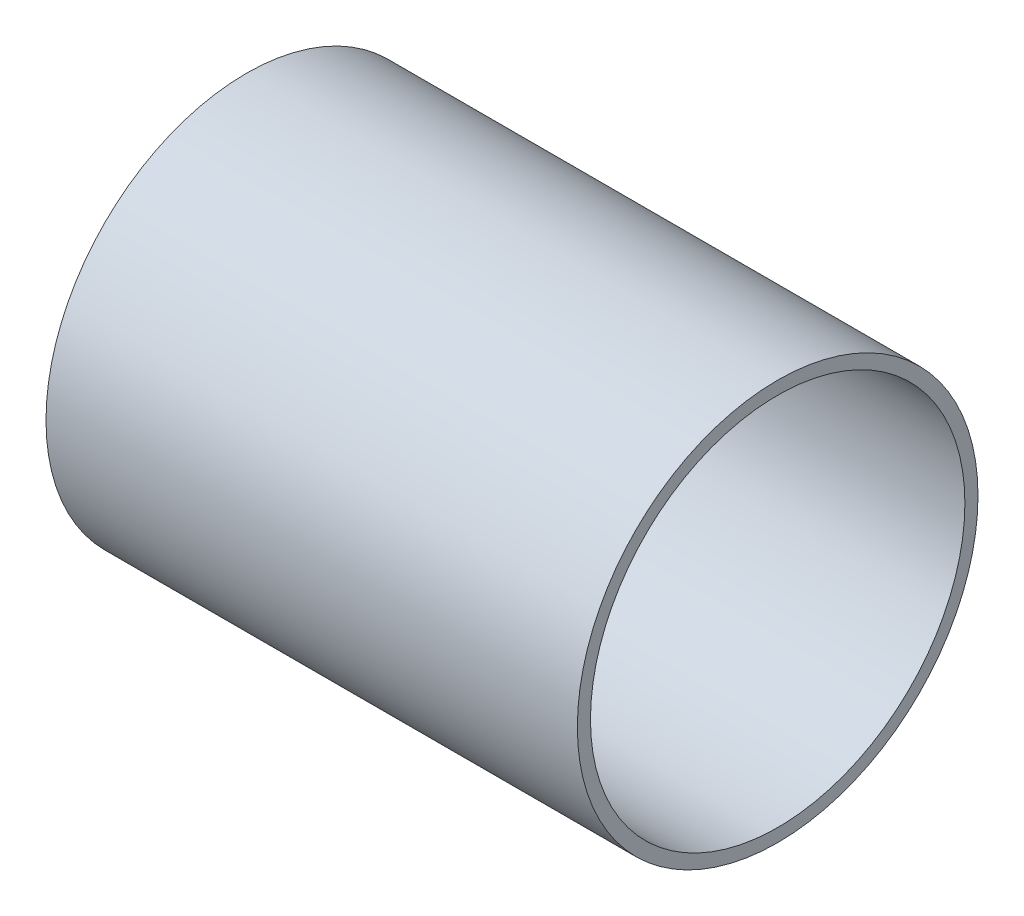
ISO-10303-21;
HEADER;
FILE_DESCRIPTION(('STEP AP214'),'2;1');
FILE_NAME('part.step','',(''),(''),'','','');
FILE_SCHEMA(('AUTOMOTIVE_DESIGN { 1 0 10303 214 1 1 1 1 }'));
ENDSEC;
DATA;
#1=APPLICATION_CONTEXT('core data for automotive mechanical design processes');
#2=APPLICATION_PROTOCOL_DEFINITION('international standard','automotive_design',2000,#1);
#3=PRODUCT_CONTEXT('',#1,'mechanical');
#4=PRODUCT('Part','Part','',(#3));
#5=PRODUCT_RELATED_PRODUCT_CATEGORY('part','',(#4));
#6=PRODUCT_DEFINITION_FORMATION('','',#4);
#7=PRODUCT_DEFINITION_CONTEXT('part definition',#1,'design');
#8=PRODUCT_DEFINITION('design','',#6,#7);
#9=PRODUCT_DEFINITION_SHAPE('','',#8);
#10=(LENGTH_UNIT() NAMED_UNIT(*) SI_UNIT(.MILLI.,.METRE.));
#11=(NAMED_UNIT(*) PLANE_ANGLE_UNIT() SI_UNIT($,.RADIAN.));
#12=(NAMED_UNIT(*) SI_UNIT($,.STERADIAN.) SOLID_ANGLE_UNIT());
#13=UNCERTAINTY_MEASURE_WITH_UNIT(LENGTH_MEASURE(1.E-05),#10,'distance_accuracy_value','');
#14=(GEOMETRIC_REPRESENTATION_CONTEXT(3) GLOBAL_UNCERTAINTY_ASSIGNED_CONTEXT((#13)) GLOBAL_UNIT_ASSIGNED_CONTEXT((#10,
#11,#12)) REPRESENTATION_CONTEXT('',''));
#15=CARTESIAN_POINT('',(0.,0.,0.));
#16=DIRECTION('',(0.,0.,1.));
#17=DIRECTION('',(1.,0.,0.));
#18=AXIS2_PLACEMENT_3D('',#15,#16,#17);
#19=CARTESIAN_POINT('',(100.092447703533,-199.389340658954,-22.0425890832618));
#20=DIRECTION('',(-1.,0.,0.));
#21=DIRECTION('',(0.,-1.,0.));
#22=AXIS2_PLACEMENT_3D('',#19,#20,#21);
#23=CYLINDRICAL_SURFACE('',#22,7.08601581282833);
#24=CARTESIAN_POINT('',(81.2964477035328,-199.389340658954,-22.0425890832618));
#25=DIRECTION('',(-1.,0.,0.));
#26=DIRECTION('',(0.,-1.,0.));
#27=AXIS2_PLACEMENT_3D('',#24,#25,#26);
#28=CIRCLE('',#27,7.08601581282833);
#29=CARTESIAN_POINT('',(81.2964477035328,-206.475356471782,-22.0425890832618));
#30=VERTEX_POINT('',#29);
#31=EDGE_CURVE('E19',#30,#30,#28,.T.);
#32=ORIENTED_EDGE('',*,*,#31,.F.);
#33=EDGE_LOOP('',(#32));
#34=FACE_BOUND('',#33,.T.);
#35=CARTESIAN_POINT('',(100.092447703533,-199.389340658954,-22.0425890832618));
#36=DIRECTION('',(-1.,0.,0.));
#37=DIRECTION('',(0.,-1.,0.));
#38=AXIS2_PLACEMENT_3D('',#35,#36,#37);
#39=CIRCLE('',#38,7.08601581282833);
#40=CARTESIAN_POINT('',(100.092447703533,-206.475356471782,-22.0425890832618));
#41=VERTEX_POINT('',#40);
#42=EDGE_CURVE('E28',#41,#41,#39,.F.);
#43=ORIENTED_EDGE('',*,*,#42,.F.);
#44=EDGE_LOOP('',(#43));
#45=FACE_BOUND('',#44,.T.);
#46=ADVANCED_FACE('F15',(#34,#45),#23,.T.);
#47=CARTESIAN_POINT('',(81.2964477035328,-192.277924846126,-29.15400489609));
#48=DIRECTION('',(-1.,0.,0.));
#49=DIRECTION('',(0.,-1.,0.));
#50=AXIS2_PLACEMENT_3D('',#47,#48,#49);
#51=PLANE('',#50);
#52=CARTESIAN_POINT('',(81.2964477035328,-199.389340658954,-22.0425890832618));
#53=DIRECTION('',(1.,0.,0.));
#54=DIRECTION('',(0.,0.,-1.));
#55=AXIS2_PLACEMENT_3D('',#52,#53,#54);
#56=CIRCLE('',#55,6.62251387520381);
#57=CARTESIAN_POINT('',(81.2964477035328,-199.389340658954,-28.6651029584656));
#58=VERTEX_POINT('',#57);
#59=EDGE_CURVE('E23',#58,#58,#56,.F.);
#60=ORIENTED_EDGE('',*,*,#59,.F.);
#61=EDGE_LOOP('',(#60));
#62=FACE_BOUND('',#61,.T.);
#63=ORIENTED_EDGE('',*,*,#31,.T.);
#64=EDGE_LOOP('',(#63));
#65=FACE_BOUND('',#64,.T.);
#66=ADVANCED_FACE('F36',(#62,#65),#51,.T.);
#67=CARTESIAN_POINT('',(100.092447703533,-206.500756471782,-29.15400489609));
#68=DIRECTION('',(1.,0.,0.));
#69=DIRECTION('',(0.,1.,0.));
#70=AXIS2_PLACEMENT_3D('',#67,#68,#69);
#71=PLANE('',#70);
#72=CARTESIAN_POINT('',(100.092447703533,-199.389340658954,-22.0425890832618));
#73=DIRECTION('',(1.,0.,0.));
#74=DIRECTION('',(0.,0.,-1.));
#75=AXIS2_PLACEMENT_3D('',#72,#73,#74);
#76=CIRCLE('',#75,6.62251387520381);
#77=CARTESIAN_POINT('',(100.092447703533,-199.389340658954,-28.6651029584656));
#78=VERTEX_POINT('',#77);
#79=EDGE_CURVE('E10',#78,#78,#76,.T.);
#80=ORIENTED_EDGE('',*,*,#79,.F.);
#81=EDGE_LOOP('',(#80));
#82=FACE_BOUND('',#81,.T.);
#83=ORIENTED_EDGE('',*,*,#42,.T.);
#84=EDGE_LOOP('',(#83));
#85=FACE_BOUND('',#84,.T.);
#86=ADVANCED_FACE('F45',(#82,#85),#71,.T.);
#87=CARTESIAN_POINT('',(81.2964477035328,-199.389340658954,-22.0425890832618));
#88=DIRECTION('',(1.,0.,0.));
#89=DIRECTION('',(0.,0.,-1.));
#90=AXIS2_PLACEMENT_3D('',#87,#88,#89);
#91=CYLINDRICAL_SURFACE('',#90,6.62251387520381);
#92=ORIENTED_EDGE('',*,*,#79,.T.);
#93=EDGE_LOOP('',(#92));
#94=FACE_BOUND('',#93,.T.);
#95=ORIENTED_EDGE('',*,*,#59,.T.);
#96=EDGE_LOOP('',(#95));
#97=FACE_BOUND('',#96,.T.);
#98=ADVANCED_FACE('F17',(#94,#97),#91,.F.);
#99=CLOSED_SHELL('',(#46,#66,#86,#98));
#100=MANIFOLD_SOLID_BREP('B1',#99);
#101=ADVANCED_BREP_SHAPE_REPRESENTATION('',(#18,#100),#14);
#102=SHAPE_DEFINITION_REPRESENTATION(#9,#101);
ENDSEC;
END-ISO-10303-21;
